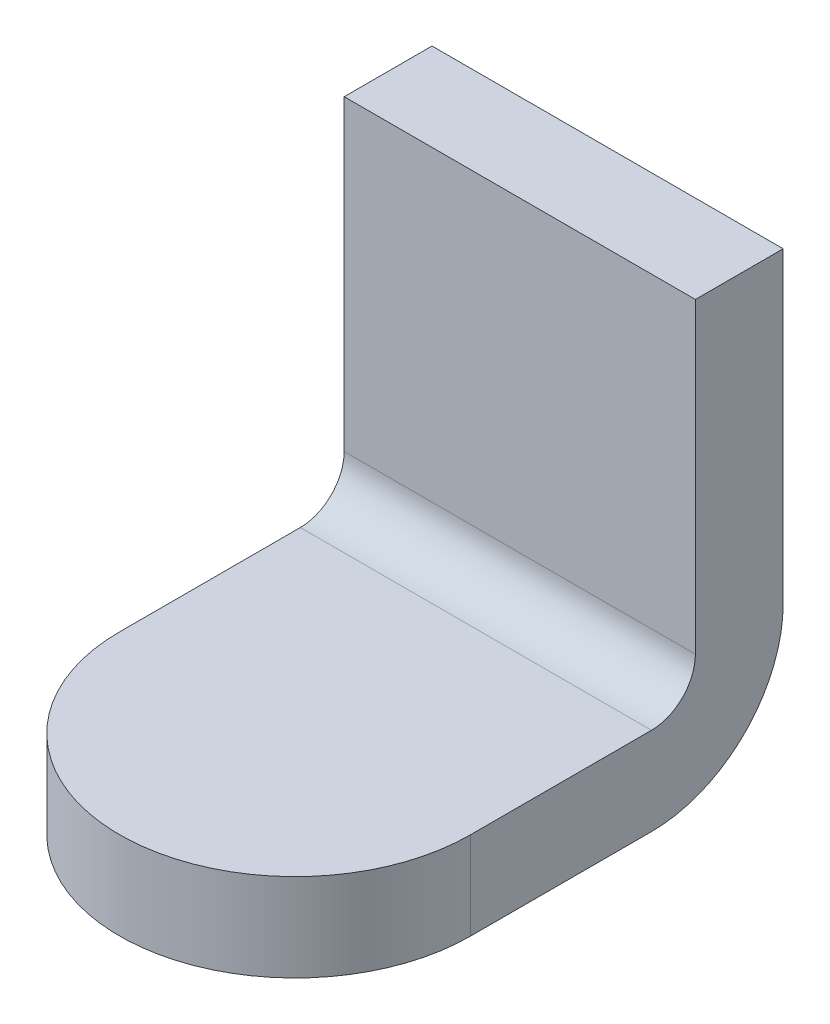
ISO-10303-21;
HEADER;
FILE_DESCRIPTION(('STEP AP214'),'2;1');
FILE_NAME('part.step','',(''),(''),'','','');
FILE_SCHEMA(('AUTOMOTIVE_DESIGN { 1 0 10303 214 1 1 1 1 }'));
ENDSEC;
DATA;
#1=APPLICATION_CONTEXT('core data for automotive mechanical design processes');
#2=APPLICATION_PROTOCOL_DEFINITION('international standard','automotive_design',2000,#1);
#3=PRODUCT_CONTEXT('',#1,'mechanical');
#4=PRODUCT('Part','Part','',(#3));
#5=PRODUCT_RELATED_PRODUCT_CATEGORY('part','',(#4));
#6=PRODUCT_DEFINITION_FORMATION('','',#4);
#7=PRODUCT_DEFINITION_CONTEXT('part definition',#1,'design');
#8=PRODUCT_DEFINITION('design','',#6,#7);
#9=PRODUCT_DEFINITION_SHAPE('','',#8);
#10=(LENGTH_UNIT() NAMED_UNIT(*) SI_UNIT(.MILLI.,.METRE.));
#11=(NAMED_UNIT(*) PLANE_ANGLE_UNIT() SI_UNIT($,.RADIAN.));
#12=(NAMED_UNIT(*) SI_UNIT($,.STERADIAN.) SOLID_ANGLE_UNIT());
#13=UNCERTAINTY_MEASURE_WITH_UNIT(LENGTH_MEASURE(1.E-05),#10,'distance_accuracy_value','');
#14=(GEOMETRIC_REPRESENTATION_CONTEXT(3) GLOBAL_UNCERTAINTY_ASSIGNED_CONTEXT((#13)) GLOBAL_UNIT_ASSIGNED_CONTEXT((#10,
#11,#12)) REPRESENTATION_CONTEXT('',''));
#15=CARTESIAN_POINT('',(0.,0.,0.));
#16=DIRECTION('',(0.,0.,1.));
#17=DIRECTION('',(1.,0.,0.));
#18=AXIS2_PLACEMENT_3D('',#15,#16,#17);
#19=CARTESIAN_POINT('',(-40.,20.,0.));
#20=DIRECTION('',(-1.,0.,0.));
#21=DIRECTION('',(0.,0.,1.));
#22=AXIS2_PLACEMENT_3D('',#19,#20,#21);
#23=PLANE('',#22);
#24=DIRECTION('',(0.,-1.,0.));
#25=VECTOR('',#24,1.);
#26=CARTESIAN_POINT('',(-40.,20.,-71.1893897623781));
#27=LINE('',#26,#25);
#28=CARTESIAN_POINT('',(-40.,100.,-71.1893897623781));
#29=VERTEX_POINT('',#28);
#30=CARTESIAN_POINT('',(-40.,30.,-71.1893897623781));
#31=VERTEX_POINT('',#30);
#32=EDGE_CURVE('E138',#29,#31,#27,.T.);
#33=ORIENTED_EDGE('',*,*,#32,.T.);
#34=CARTESIAN_POINT('',(-40.,30.,-41.1893897623781));
#35=DIRECTION('',(-1.,0.,0.));
#36=DIRECTION('',(0.,0.,1.));
#37=AXIS2_PLACEMENT_3D('',#34,#35,#36);
#38=CIRCLE('',#37,30.);
#39=CARTESIAN_POINT('',(-40.,0.,-41.1893897623781));
#40=VERTEX_POINT('',#39);
#41=EDGE_CURVE('E11',#31,#40,#38,.T.);
#42=ORIENTED_EDGE('',*,*,#41,.T.);
#43=DIRECTION('',(0.,0.,-1.));
#44=VECTOR('',#43,1.);
#45=CARTESIAN_POINT('',(-40.,0.,0.));
#46=LINE('',#45,#44);
#47=CARTESIAN_POINT('',(-40.,0.,0.));
#48=VERTEX_POINT('',#47);
#49=EDGE_CURVE('E123',#48,#40,#46,.T.);
#50=ORIENTED_EDGE('',*,*,#49,.F.);
#51=DIRECTION('',(0.,-1.,0.));
#52=VECTOR('',#51,1.);
#53=CARTESIAN_POINT('',(-40.,20.,0.));
#54=LINE('',#53,#52);
#55=CARTESIAN_POINT('',(-40.,20.,0.));
#56=VERTEX_POINT('',#55);
#57=EDGE_CURVE('E149',#56,#48,#54,.T.);
#58=ORIENTED_EDGE('',*,*,#57,.F.);
#59=DIRECTION('',(0.,0.,-1.));
#60=VECTOR('',#59,1.);
#61=CARTESIAN_POINT('',(-40.,20.,0.));
#62=LINE('',#61,#60);
#63=CARTESIAN_POINT('',(-40.,20.,-41.1893897623781));
#64=VERTEX_POINT('',#63);
#65=EDGE_CURVE('E131',#56,#64,#62,.T.);
#66=ORIENTED_EDGE('',*,*,#65,.T.);
#67=CARTESIAN_POINT('',(-40.,30.,-41.1893897623781));
#68=DIRECTION('',(-1.,0.,0.));
#69=DIRECTION('',(0.,0.,1.));
#70=AXIS2_PLACEMENT_3D('',#67,#68,#69);
#71=CIRCLE('',#70,10.);
#72=CARTESIAN_POINT('',(-40.,30.,-51.1893897623781));
#73=VERTEX_POINT('',#72);
#74=EDGE_CURVE('E122',#64,#73,#71,.F.);
#75=ORIENTED_EDGE('',*,*,#74,.T.);
#76=DIRECTION('',(0.,-1.,0.));
#77=VECTOR('',#76,1.);
#78=CARTESIAN_POINT('',(-40.,100.,-51.1893897623781));
#79=LINE('',#78,#77);
#80=CARTESIAN_POINT('',(-40.,100.,-51.1893897623781));
#81=VERTEX_POINT('',#80);
#82=EDGE_CURVE('E103',#81,#73,#79,.T.);
#83=ORIENTED_EDGE('',*,*,#82,.F.);
#84=DIRECTION('',(0.,0.,1.));
#85=VECTOR('',#84,1.);
#86=CARTESIAN_POINT('',(-40.,100.,-71.1893897623781));
#87=LINE('',#86,#85);
#88=EDGE_CURVE('E111',#29,#81,#87,.T.);
#89=ORIENTED_EDGE('',*,*,#88,.F.);
#90=EDGE_LOOP('',(#33,#42,#50,#58,#66,#75,#83,#89));
#91=FACE_BOUND('',#90,.T.);
#92=ADVANCED_FACE('F35',(#91),#23,.T.);
#93=CARTESIAN_POINT('',(0.,20.,0.));
#94=DIRECTION('',(0.,-1.,0.));
#95=DIRECTION('',(0.,0.,-1.));
#96=AXIS2_PLACEMENT_3D('',#93,#94,#95);
#97=CYLINDRICAL_SURFACE('',#96,40.);
#98=CARTESIAN_POINT('',(0.,0.,0.));
#99=DIRECTION('',(0.,1.,0.));
#100=DIRECTION('',(0.,0.,1.));
#101=AXIS2_PLACEMENT_3D('',#98,#99,#100);
#102=CIRCLE('',#101,40.);
#103=CARTESIAN_POINT('',(40.,0.,0.));
#104=VERTEX_POINT('',#103);
#105=EDGE_CURVE('E126',#48,#104,#102,.T.);
#106=ORIENTED_EDGE('',*,*,#105,.T.);
#107=DIRECTION('',(0.,-1.,0.));
#108=VECTOR('',#107,1.);
#109=CARTESIAN_POINT('',(40.,20.,0.));
#110=LINE('',#109,#108);
#111=CARTESIAN_POINT('',(40.,20.,0.));
#112=VERTEX_POINT('',#111);
#113=EDGE_CURVE('E146',#112,#104,#110,.T.);
#114=ORIENTED_EDGE('',*,*,#113,.F.);
#115=CARTESIAN_POINT('',(0.,20.,0.));
#116=DIRECTION('',(0.,1.,0.));
#117=DIRECTION('',(0.,0.,1.));
#118=AXIS2_PLACEMENT_3D('',#115,#116,#117);
#119=CIRCLE('',#118,40.);
#120=EDGE_CURVE('E133',#56,#112,#119,.T.);
#121=ORIENTED_EDGE('',*,*,#120,.F.);
#122=ORIENTED_EDGE('',*,*,#57,.T.);
#123=EDGE_LOOP('',(#106,#114,#121,#122));
#124=FACE_BOUND('',#123,.T.);
#125=ADVANCED_FACE('F173',(#124),#97,.T.);
#126=CARTESIAN_POINT('',(40.,20.,0.));
#127=DIRECTION('',(1.,0.,0.));
#128=DIRECTION('',(0.,0.,-1.));
#129=AXIS2_PLACEMENT_3D('',#126,#127,#128);
#130=PLANE('',#129);
#131=DIRECTION('',(0.,0.,1.));
#132=VECTOR('',#131,1.);
#133=CARTESIAN_POINT('',(40.,0.,0.));
#134=LINE('',#133,#132);
#135=CARTESIAN_POINT('',(40.,0.,-41.1893897623781));
#136=VERTEX_POINT('',#135);
#137=EDGE_CURVE('E134',#136,#104,#134,.T.);
#138=ORIENTED_EDGE('',*,*,#137,.F.);
#139=CARTESIAN_POINT('',(40.,30.,-41.1893897623781));
#140=DIRECTION('',(1.,0.,0.));
#141=DIRECTION('',(0.,0.,-1.));
#142=AXIS2_PLACEMENT_3D('',#139,#140,#141);
#143=CIRCLE('',#142,30.);
#144=CARTESIAN_POINT('',(40.,30.,-71.1893897623781));
#145=VERTEX_POINT('',#144);
#146=EDGE_CURVE('E57',#136,#145,#143,.T.);
#147=ORIENTED_EDGE('',*,*,#146,.T.);
#148=DIRECTION('',(0.,-1.,0.));
#149=VECTOR('',#148,1.);
#150=CARTESIAN_POINT('',(40.,20.,-71.1893897623781));
#151=LINE('',#150,#149);
#152=CARTESIAN_POINT('',(40.,100.,-71.1893897623781));
#153=VERTEX_POINT('',#152);
#154=EDGE_CURVE('E144',#153,#145,#151,.T.);
#155=ORIENTED_EDGE('',*,*,#154,.F.);
#156=DIRECTION('',(0.,0.,-1.));
#157=VECTOR('',#156,1.);
#158=CARTESIAN_POINT('',(40.,100.,-71.1893897623781));
#159=LINE('',#158,#157);
#160=CARTESIAN_POINT('',(40.,100.,-51.1893897623781));
#161=VERTEX_POINT('',#160);
#162=EDGE_CURVE('E110',#161,#153,#159,.T.);
#163=ORIENTED_EDGE('',*,*,#162,.F.);
#164=DIRECTION('',(0.,-1.,0.));
#165=VECTOR('',#164,1.);
#166=CARTESIAN_POINT('',(40.,100.,-51.1893897623781));
#167=LINE('',#166,#165);
#168=CARTESIAN_POINT('',(40.,30.,-51.1893897623781));
#169=VERTEX_POINT('',#168);
#170=EDGE_CURVE('E106',#161,#169,#167,.T.);
#171=ORIENTED_EDGE('',*,*,#170,.T.);
#172=CARTESIAN_POINT('',(40.,30.,-41.1893897623781));
#173=DIRECTION('',(1.,0.,0.));
#174=DIRECTION('',(0.,0.,-1.));
#175=AXIS2_PLACEMENT_3D('',#172,#173,#174);
#176=CIRCLE('',#175,10.);
#177=CARTESIAN_POINT('',(40.,20.,-41.1893897623781));
#178=VERTEX_POINT('',#177);
#179=EDGE_CURVE('E155',#169,#178,#176,.F.);
#180=ORIENTED_EDGE('',*,*,#179,.T.);
#181=DIRECTION('',(0.,0.,1.));
#182=VECTOR('',#181,1.);
#183=CARTESIAN_POINT('',(40.,20.,0.));
#184=LINE('',#183,#182);
#185=EDGE_CURVE('E137',#178,#112,#184,.T.);
#186=ORIENTED_EDGE('',*,*,#185,.T.);
#187=ORIENTED_EDGE('',*,*,#113,.T.);
#188=EDGE_LOOP('',(#138,#147,#155,#163,#171,#180,#186,#187));
#189=FACE_BOUND('',#188,.T.);
#190=ADVANCED_FACE('F168',(#189),#130,.T.);
#191=CARTESIAN_POINT('',(0.,20.,-71.1893897623781));
#192=DIRECTION('',(0.,0.,-1.));
#193=DIRECTION('',(-1.,0.,0.));
#194=AXIS2_PLACEMENT_3D('',#191,#192,#193);
#195=PLANE('',#194);
#196=ORIENTED_EDGE('',*,*,#154,.T.);
#197=DIRECTION('',(1.,0.,0.));
#198=VECTOR('',#197,1.);
#199=CARTESIAN_POINT('',(-40.,30.,-71.1893897623781));
#200=LINE('',#199,#198);
#201=EDGE_CURVE('E43',#145,#31,#200,.F.);
#202=ORIENTED_EDGE('',*,*,#201,.T.);
#203=ORIENTED_EDGE('',*,*,#32,.F.);
#204=DIRECTION('',(-1.,0.,0.));
#205=VECTOR('',#204,1.);
#206=CARTESIAN_POINT('',(-40.,100.,-71.1893897623781));
#207=LINE('',#206,#205);
#208=EDGE_CURVE('E117',#153,#29,#207,.T.);
#209=ORIENTED_EDGE('',*,*,#208,.F.);
#210=EDGE_LOOP('',(#196,#202,#203,#209));
#211=FACE_BOUND('',#210,.T.);
#212=ADVANCED_FACE('F189',(#211),#195,.T.);
#213=CARTESIAN_POINT('',(0.,20.,0.));
#214=DIRECTION('',(0.,1.,0.));
#215=DIRECTION('',(0.,0.,1.));
#216=AXIS2_PLACEMENT_3D('',#213,#214,#215);
#217=PLANE('',#216);
#218=ORIENTED_EDGE('',*,*,#185,.F.);
#219=DIRECTION('',(1.,0.,0.));
#220=VECTOR('',#219,1.);
#221=CARTESIAN_POINT('',(0.,20.,-41.1893897623781));
#222=LINE('',#221,#220);
#223=EDGE_CURVE('E153',#178,#64,#222,.F.);
#224=ORIENTED_EDGE('',*,*,#223,.T.);
#225=ORIENTED_EDGE('',*,*,#65,.F.);
#226=ORIENTED_EDGE('',*,*,#120,.T.);
#227=EDGE_LOOP('',(#218,#224,#225,#226));
#228=FACE_BOUND('',#227,.T.);
#229=ADVANCED_FACE('F192',(#228),#217,.T.);
#230=CARTESIAN_POINT('',(0.,0.,0.));
#231=DIRECTION('',(0.,1.,0.));
#232=DIRECTION('',(0.,0.,1.));
#233=AXIS2_PLACEMENT_3D('',#230,#231,#232);
#234=PLANE('',#233);
#235=ORIENTED_EDGE('',*,*,#49,.T.);
#236=DIRECTION('',(1.,0.,0.));
#237=VECTOR('',#236,1.);
#238=CARTESIAN_POINT('',(40.,0.,-41.1893897623781));
#239=LINE('',#238,#237);
#240=EDGE_CURVE('E158',#40,#136,#239,.T.);
#241=ORIENTED_EDGE('',*,*,#240,.T.);
#242=ORIENTED_EDGE('',*,*,#137,.T.);
#243=ORIENTED_EDGE('',*,*,#105,.F.);
#244=EDGE_LOOP('',(#235,#241,#242,#243));
#245=FACE_BOUND('',#244,.T.);
#246=ADVANCED_FACE('F163',(#245),#234,.F.);
#247=CARTESIAN_POINT('',(-40.,100.,-51.1893897623781));
#248=DIRECTION('',(0.,0.,-1.));
#249=DIRECTION('',(-1.,0.,0.));
#250=AXIS2_PLACEMENT_3D('',#247,#248,#249);
#251=PLANE('',#250);
#252=ORIENTED_EDGE('',*,*,#82,.T.);
#253=DIRECTION('',(1.,0.,0.));
#254=VECTOR('',#253,1.);
#255=CARTESIAN_POINT('',(-40.,30.,-51.1893897623781));
#256=LINE('',#255,#254);
#257=EDGE_CURVE('E151',#73,#169,#256,.T.);
#258=ORIENTED_EDGE('',*,*,#257,.T.);
#259=ORIENTED_EDGE('',*,*,#170,.F.);
#260=DIRECTION('',(1.,0.,0.));
#261=VECTOR('',#260,1.);
#262=CARTESIAN_POINT('',(-40.,100.,-51.1893897623781));
#263=LINE('',#262,#261);
#264=EDGE_CURVE('E98',#81,#161,#263,.T.);
#265=ORIENTED_EDGE('',*,*,#264,.F.);
#266=EDGE_LOOP('',(#252,#258,#259,#265));
#267=FACE_BOUND('',#266,.T.);
#268=ADVANCED_FACE('F100',(#267),#251,.F.);
#269=CARTESIAN_POINT('',(0.,100.,0.));
#270=DIRECTION('',(0.,1.,0.));
#271=DIRECTION('',(0.,0.,1.));
#272=AXIS2_PLACEMENT_3D('',#269,#270,#271);
#273=PLANE('',#272);
#274=ORIENTED_EDGE('',*,*,#88,.T.);
#275=ORIENTED_EDGE('',*,*,#264,.T.);
#276=ORIENTED_EDGE('',*,*,#162,.T.);
#277=ORIENTED_EDGE('',*,*,#208,.T.);
#278=EDGE_LOOP('',(#274,#275,#276,#277));
#279=FACE_BOUND('',#278,.T.);
#280=ADVANCED_FACE('F115',(#279),#273,.T.);
#281=CARTESIAN_POINT('',(-40.,30.,-41.1893897623781));
#282=DIRECTION('',(1.,0.,0.));
#283=DIRECTION('',(0.,0.,-1.));
#284=AXIS2_PLACEMENT_3D('',#281,#282,#283);
#285=CYLINDRICAL_SURFACE('',#284,10.);
#286=ORIENTED_EDGE('',*,*,#74,.F.);
#287=ORIENTED_EDGE('',*,*,#223,.F.);
#288=ORIENTED_EDGE('',*,*,#179,.F.);
#289=ORIENTED_EDGE('',*,*,#257,.F.);
#290=EDGE_LOOP('',(#286,#287,#288,#289));
#291=FACE_BOUND('',#290,.T.);
#292=ADVANCED_FACE('F175',(#291),#285,.F.);
#293=CARTESIAN_POINT('',(0.,30.,-41.1893897623781));
#294=DIRECTION('',(-1.,0.,0.));
#295=DIRECTION('',(0.,0.,1.));
#296=AXIS2_PLACEMENT_3D('',#293,#294,#295);
#297=CYLINDRICAL_SURFACE('',#296,30.);
#298=ORIENTED_EDGE('',*,*,#41,.F.);
#299=ORIENTED_EDGE('',*,*,#201,.F.);
#300=ORIENTED_EDGE('',*,*,#146,.F.);
#301=ORIENTED_EDGE('',*,*,#240,.F.);
#302=EDGE_LOOP('',(#298,#299,#300,#301));
#303=FACE_BOUND('',#302,.T.);
#304=ADVANCED_FACE('F37',(#303),#297,.T.);
#305=CLOSED_SHELL('',(#92,#125,#190,#212,#229,#246,#268,#280,#292,#304));
#306=MANIFOLD_SOLID_BREP('B2',#305);
#307=ADVANCED_BREP_SHAPE_REPRESENTATION('',(#18,#306),#14);
#308=SHAPE_DEFINITION_REPRESENTATION(#9,#307);
ENDSEC;
END-ISO-10303-21;
